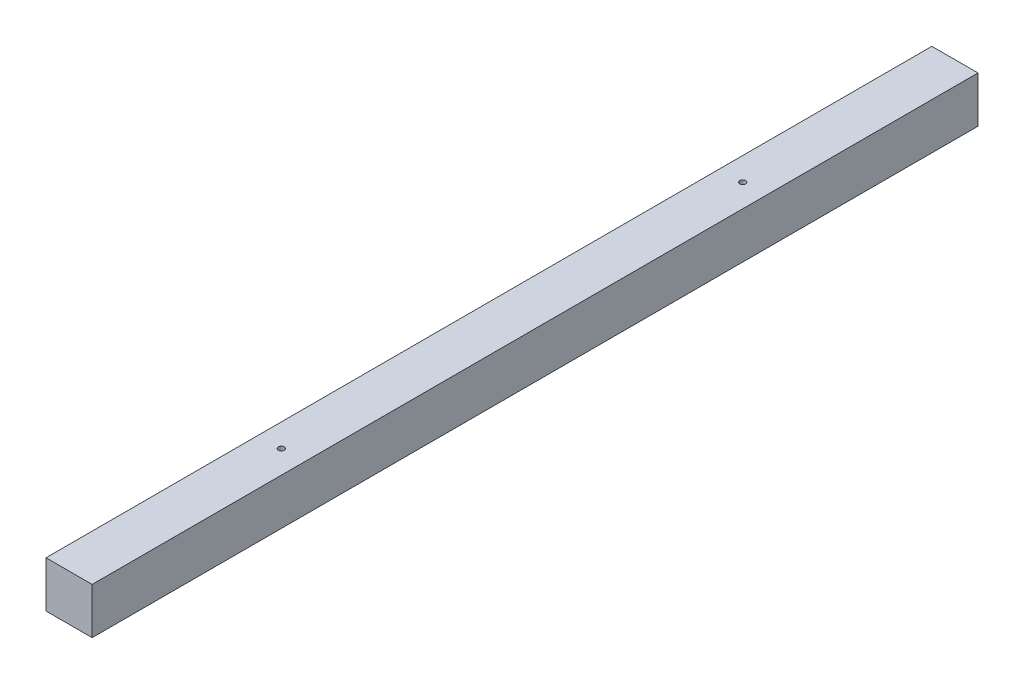
ISO-10303-21;
HEADER;
FILE_DESCRIPTION(('STEP AP214'),'2;1');
FILE_NAME('part.step','',(''),(''),'','','');
FILE_SCHEMA(('AUTOMOTIVE_DESIGN { 1 0 10303 214 1 1 1 1 }'));
ENDSEC;
DATA;
#1=APPLICATION_CONTEXT('core data for automotive mechanical design processes');
#2=APPLICATION_PROTOCOL_DEFINITION('international standard','automotive_design',2000,#1);
#3=PRODUCT_CONTEXT('',#1,'mechanical');
#4=PRODUCT('Part','Part','',(#3));
#5=PRODUCT_RELATED_PRODUCT_CATEGORY('part','',(#4));
#6=PRODUCT_DEFINITION_FORMATION('','',#4);
#7=PRODUCT_DEFINITION_CONTEXT('part definition',#1,'design');
#8=PRODUCT_DEFINITION('design','',#6,#7);
#9=PRODUCT_DEFINITION_SHAPE('','',#8);
#10=(LENGTH_UNIT() NAMED_UNIT(*) SI_UNIT(.MILLI.,.METRE.));
#11=(NAMED_UNIT(*) PLANE_ANGLE_UNIT() SI_UNIT($,.RADIAN.));
#12=(NAMED_UNIT(*) SI_UNIT($,.STERADIAN.) SOLID_ANGLE_UNIT());
#13=UNCERTAINTY_MEASURE_WITH_UNIT(LENGTH_MEASURE(1.E-05),#10,'distance_accuracy_value','');
#14=(GEOMETRIC_REPRESENTATION_CONTEXT(3) GLOBAL_UNCERTAINTY_ASSIGNED_CONTEXT((#13)) GLOBAL_UNIT_ASSIGNED_CONTEXT((#10,
#11,#12)) REPRESENTATION_CONTEXT('',''));
#15=CARTESIAN_POINT('',(0.,0.,0.));
#16=DIRECTION('',(0.,0.,1.));
#17=DIRECTION('',(1.,0.,0.));
#18=AXIS2_PLACEMENT_3D('',#15,#16,#17);
#19=CARTESIAN_POINT('',(0.,0.,480.));
#20=DIRECTION('',(1.,0.,0.));
#21=DIRECTION('',(0.,0.,-1.));
#22=AXIS2_PLACEMENT_3D('',#19,#20,#21);
#23=PLANE('',#22);
#24=DIRECTION('',(0.,-1.,0.));
#25=VECTOR('',#24,1.);
#26=CARTESIAN_POINT('',(0.,0.,0.));
#27=LINE('',#26,#25);
#28=CARTESIAN_POINT('',(0.,25.,0.));
#29=VERTEX_POINT('',#28);
#30=CARTESIAN_POINT('',(0.,0.,0.));
#31=VERTEX_POINT('',#30);
#32=EDGE_CURVE('E112',#29,#31,#27,.T.);
#33=ORIENTED_EDGE('',*,*,#32,.T.);
#34=DIRECTION('',(0.,0.,-1.));
#35=VECTOR('',#34,1.);
#36=CARTESIAN_POINT('',(0.,0.,480.));
#37=LINE('',#36,#35);
#38=CARTESIAN_POINT('',(0.,0.,480.));
#39=VERTEX_POINT('',#38);
#40=EDGE_CURVE('E11',#39,#31,#37,.T.);
#41=ORIENTED_EDGE('',*,*,#40,.F.);
#42=DIRECTION('',(0.,-1.,0.));
#43=VECTOR('',#42,1.);
#44=CARTESIAN_POINT('',(0.,0.,480.));
#45=LINE('',#44,#43);
#46=CARTESIAN_POINT('',(0.,25.,480.));
#47=VERTEX_POINT('',#46);
#48=EDGE_CURVE('E113',#47,#39,#45,.T.);
#49=ORIENTED_EDGE('',*,*,#48,.F.);
#50=DIRECTION('',(0.,0.,-1.));
#51=VECTOR('',#50,1.);
#52=CARTESIAN_POINT('',(0.,25.,480.));
#53=LINE('',#52,#51);
#54=EDGE_CURVE('E119',#47,#29,#53,.T.);
#55=ORIENTED_EDGE('',*,*,#54,.T.);
#56=EDGE_LOOP('',(#33,#41,#49,#55));
#57=FACE_BOUND('',#56,.T.);
#58=ADVANCED_FACE('F37',(#57),#23,.F.);
#59=CARTESIAN_POINT('',(0.,0.,480.));
#60=DIRECTION('',(0.,1.,0.));
#61=DIRECTION('',(0.,0.,1.));
#62=AXIS2_PLACEMENT_3D('',#59,#60,#61);
#63=PLANE('',#62);
#64=DIRECTION('',(1.,0.,0.));
#65=VECTOR('',#64,1.);
#66=CARTESIAN_POINT('',(0.,0.,0.));
#67=LINE('',#66,#65);
#68=CARTESIAN_POINT('',(25.,0.,0.));
#69=VERTEX_POINT('',#68);
#70=EDGE_CURVE('E122',#31,#69,#67,.T.);
#71=ORIENTED_EDGE('',*,*,#70,.T.);
#72=DIRECTION('',(0.,0.,-1.));
#73=VECTOR('',#72,1.);
#74=CARTESIAN_POINT('',(25.,0.,480.));
#75=LINE('',#74,#73);
#76=CARTESIAN_POINT('',(25.,0.,480.));
#77=VERTEX_POINT('',#76);
#78=EDGE_CURVE('E45',#77,#69,#75,.T.);
#79=ORIENTED_EDGE('',*,*,#78,.F.);
#80=DIRECTION('',(1.,0.,0.));
#81=VECTOR('',#80,1.);
#82=CARTESIAN_POINT('',(0.,0.,480.));
#83=LINE('',#82,#81);
#84=EDGE_CURVE('E84',#39,#77,#83,.T.);
#85=ORIENTED_EDGE('',*,*,#84,.F.);
#86=ORIENTED_EDGE('',*,*,#40,.T.);
#87=EDGE_LOOP('',(#71,#79,#85,#86));
#88=FACE_BOUND('',#87,.T.);
#89=ADVANCED_FACE('F146',(#88),#63,.F.);
#90=CARTESIAN_POINT('',(25.,0.,480.));
#91=DIRECTION('',(-1.,0.,0.));
#92=DIRECTION('',(0.,-1.,0.));
#93=AXIS2_PLACEMENT_3D('',#90,#91,#92);
#94=PLANE('',#93);
#95=DIRECTION('',(0.,1.,0.));
#96=VECTOR('',#95,1.);
#97=CARTESIAN_POINT('',(25.,0.,0.));
#98=LINE('',#97,#96);
#99=CARTESIAN_POINT('',(25.,25.,0.));
#100=VERTEX_POINT('',#99);
#101=EDGE_CURVE('E71',#69,#100,#98,.T.);
#102=ORIENTED_EDGE('',*,*,#101,.T.);
#103=DIRECTION('',(0.,0.,-1.));
#104=VECTOR('',#103,1.);
#105=CARTESIAN_POINT('',(25.,25.,480.));
#106=LINE('',#105,#104);
#107=CARTESIAN_POINT('',(25.,25.,480.));
#108=VERTEX_POINT('',#107);
#109=EDGE_CURVE('E127',#108,#100,#106,.T.);
#110=ORIENTED_EDGE('',*,*,#109,.F.);
#111=DIRECTION('',(0.,1.,0.));
#112=VECTOR('',#111,1.);
#113=CARTESIAN_POINT('',(25.,0.,480.));
#114=LINE('',#113,#112);
#115=EDGE_CURVE('E116',#77,#108,#114,.T.);
#116=ORIENTED_EDGE('',*,*,#115,.F.);
#117=ORIENTED_EDGE('',*,*,#78,.T.);
#118=EDGE_LOOP('',(#102,#110,#116,#117));
#119=FACE_BOUND('',#118,.T.);
#120=ADVANCED_FACE('F129',(#119),#94,.F.);
#121=CARTESIAN_POINT('',(0.,25.,480.));
#122=DIRECTION('',(0.,-1.,0.));
#123=DIRECTION('',(0.,0.,-1.));
#124=AXIS2_PLACEMENT_3D('',#121,#122,#123);
#125=PLANE('',#124);
#126=CARTESIAN_POINT('',(12.5,25.,115.));
#127=DIRECTION('',(0.,1.,0.));
#128=DIRECTION('',(0.,0.,1.));
#129=AXIS2_PLACEMENT_3D('',#126,#127,#128);
#130=CIRCLE('',#129,1.59999999999999);
#131=CARTESIAN_POINT('',(12.5,25.,116.6));
#132=VERTEX_POINT('',#131);
#133=EDGE_CURVE('E102',#132,#132,#130,.T.);
#134=ORIENTED_EDGE('',*,*,#133,.F.);
#135=EDGE_LOOP('',(#134));
#136=FACE_BOUND('',#135,.T.);
#137=CARTESIAN_POINT('',(12.5,25.,365.));
#138=DIRECTION('',(0.,1.,0.));
#139=DIRECTION('',(0.,0.,1.));
#140=AXIS2_PLACEMENT_3D('',#137,#138,#139);
#141=CIRCLE('',#140,1.59999999999999);
#142=CARTESIAN_POINT('',(12.5,25.,366.6));
#143=VERTEX_POINT('',#142);
#144=EDGE_CURVE('E101',#143,#143,#141,.T.);
#145=ORIENTED_EDGE('',*,*,#144,.F.);
#146=EDGE_LOOP('',(#145));
#147=FACE_BOUND('',#146,.T.);
#148=DIRECTION('',(-1.,0.,0.));
#149=VECTOR('',#148,1.);
#150=CARTESIAN_POINT('',(0.,25.,0.));
#151=LINE('',#150,#149);
#152=EDGE_CURVE('E77',#100,#29,#151,.T.);
#153=ORIENTED_EDGE('',*,*,#152,.T.);
#154=ORIENTED_EDGE('',*,*,#54,.F.);
#155=DIRECTION('',(-1.,0.,0.));
#156=VECTOR('',#155,1.);
#157=CARTESIAN_POINT('',(0.,25.,480.));
#158=LINE('',#157,#156);
#159=EDGE_CURVE('E53',#108,#47,#158,.T.);
#160=ORIENTED_EDGE('',*,*,#159,.F.);
#161=ORIENTED_EDGE('',*,*,#109,.T.);
#162=EDGE_LOOP('',(#153,#154,#160,#161));
#163=FACE_BOUND('',#162,.T.);
#164=ADVANCED_FACE('F136',(#136,#147,#163),#125,.F.);
#165=CARTESIAN_POINT('',(0.,0.,480.));
#166=DIRECTION('',(0.,0.,-1.));
#167=DIRECTION('',(-1.,0.,0.));
#168=AXIS2_PLACEMENT_3D('',#165,#166,#167);
#169=PLANE('',#168);
#170=ORIENTED_EDGE('',*,*,#48,.T.);
#171=ORIENTED_EDGE('',*,*,#84,.T.);
#172=ORIENTED_EDGE('',*,*,#115,.T.);
#173=ORIENTED_EDGE('',*,*,#159,.T.);
#174=EDGE_LOOP('',(#170,#171,#172,#173));
#175=FACE_BOUND('',#174,.T.);
#176=ADVANCED_FACE('F138',(#175),#169,.F.);
#177=CARTESIAN_POINT('',(0.,0.,0.));
#178=DIRECTION('',(0.,0.,-1.));
#179=DIRECTION('',(-1.,0.,0.));
#180=AXIS2_PLACEMENT_3D('',#177,#178,#179);
#181=PLANE('',#180);
#182=ORIENTED_EDGE('',*,*,#32,.F.);
#183=ORIENTED_EDGE('',*,*,#152,.F.);
#184=ORIENTED_EDGE('',*,*,#101,.F.);
#185=ORIENTED_EDGE('',*,*,#70,.F.);
#186=EDGE_LOOP('',(#182,#183,#184,#185));
#187=FACE_BOUND('',#186,.T.);
#188=ADVANCED_FACE('F132',(#187),#181,.T.);
#189=CARTESIAN_POINT('',(12.5,15.,365.));
#190=DIRECTION('',(0.,1.,0.));
#191=DIRECTION('',(0.,0.,1.));
#192=AXIS2_PLACEMENT_3D('',#189,#190,#191);
#193=CONICAL_SURFACE('',#192,1.59999999999999,1.02974425867665);
#194=CARTESIAN_POINT('',(12.5,14.0386230095559,365.));
#195=VERTEX_POINT('',#194);
#196=VERTEX_LOOP('',#195);
#197=FACE_BOUND('',#196,.T.);
#198=CARTESIAN_POINT('',(12.5,15.,365.));
#199=DIRECTION('',(0.,1.,0.));
#200=DIRECTION('',(0.,0.,1.));
#201=AXIS2_PLACEMENT_3D('',#198,#199,#200);
#202=CIRCLE('',#201,1.59999999999999);
#203=CARTESIAN_POINT('',(12.5,15.,366.6));
#204=VERTEX_POINT('',#203);
#205=EDGE_CURVE('E105',#204,#204,#202,.T.);
#206=ORIENTED_EDGE('',*,*,#205,.T.);
#207=EDGE_LOOP('',(#206));
#208=FACE_BOUND('',#207,.T.);
#209=ADVANCED_FACE('F176',(#197,#208),#193,.F.);
#210=CARTESIAN_POINT('',(12.5,25.,365.));
#211=DIRECTION('',(0.,1.,0.));
#212=DIRECTION('',(0.,0.,1.));
#213=AXIS2_PLACEMENT_3D('',#210,#211,#212);
#214=CYLINDRICAL_SURFACE('',#213,1.59999999999999);
#215=ORIENTED_EDGE('',*,*,#205,.F.);
#216=EDGE_LOOP('',(#215));
#217=FACE_BOUND('',#216,.T.);
#218=ORIENTED_EDGE('',*,*,#144,.T.);
#219=EDGE_LOOP('',(#218));
#220=FACE_BOUND('',#219,.T.);
#221=ADVANCED_FACE('F95',(#217,#220),#214,.F.);
#222=CARTESIAN_POINT('',(12.5,15.,115.));
#223=DIRECTION('',(0.,1.,0.));
#224=DIRECTION('',(0.,0.,1.));
#225=AXIS2_PLACEMENT_3D('',#222,#223,#224);
#226=CONICAL_SURFACE('',#225,1.59999999999999,1.02974425867665);
#227=CARTESIAN_POINT('',(12.5,14.0386230095559,115.));
#228=VERTEX_POINT('',#227);
#229=VERTEX_LOOP('',#228);
#230=FACE_BOUND('',#229,.T.);
#231=CARTESIAN_POINT('',(12.5,15.,115.));
#232=DIRECTION('',(0.,1.,0.));
#233=DIRECTION('',(0.,0.,1.));
#234=AXIS2_PLACEMENT_3D('',#231,#232,#233);
#235=CIRCLE('',#234,1.59999999999999);
#236=CARTESIAN_POINT('',(12.5,15.,116.6));
#237=VERTEX_POINT('',#236);
#238=EDGE_CURVE('E99',#237,#237,#235,.T.);
#239=ORIENTED_EDGE('',*,*,#238,.T.);
#240=EDGE_LOOP('',(#239));
#241=FACE_BOUND('',#240,.T.);
#242=ADVANCED_FACE('F91',(#230,#241),#226,.F.);
#243=CARTESIAN_POINT('',(12.5,25.,115.));
#244=DIRECTION('',(0.,1.,0.));
#245=DIRECTION('',(0.,0.,1.));
#246=AXIS2_PLACEMENT_3D('',#243,#244,#245);
#247=CYLINDRICAL_SURFACE('',#246,1.59999999999999);
#248=ORIENTED_EDGE('',*,*,#238,.F.);
#249=EDGE_LOOP('',(#248));
#250=FACE_BOUND('',#249,.T.);
#251=ORIENTED_EDGE('',*,*,#133,.T.);
#252=EDGE_LOOP('',(#251));
#253=FACE_BOUND('',#252,.T.);
#254=ADVANCED_FACE('F94',(#250,#253),#247,.F.);
#255=CLOSED_SHELL('',(#58,#89,#120,#164,#176,#188,#209,#221,#242,#254));
#256=MANIFOLD_SOLID_BREP('B2',#255);
#257=ADVANCED_BREP_SHAPE_REPRESENTATION('',(#18,#256),#14);
#258=SHAPE_DEFINITION_REPRESENTATION(#9,#257);
ENDSEC;
END-ISO-10303-21;
